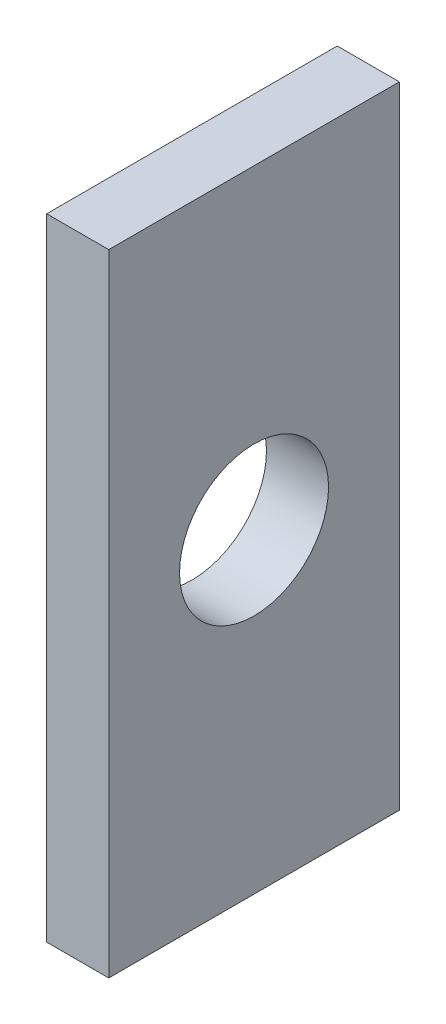
ISO-10303-21;
HEADER;
FILE_DESCRIPTION(('STEP AP214'),'2;1');
FILE_NAME('part.step','',(''),(''),'','','');
FILE_SCHEMA(('AUTOMOTIVE_DESIGN { 1 0 10303 214 1 1 1 1 }'));
ENDSEC;
DATA;
#1=APPLICATION_CONTEXT('core data for automotive mechanical design processes');
#2=APPLICATION_PROTOCOL_DEFINITION('international standard','automotive_design',2000,#1);
#3=PRODUCT_CONTEXT('',#1,'mechanical');
#4=PRODUCT('Part','Part','',(#3));
#5=PRODUCT_RELATED_PRODUCT_CATEGORY('part','',(#4));
#6=PRODUCT_DEFINITION_FORMATION('','',#4);
#7=PRODUCT_DEFINITION_CONTEXT('part definition',#1,'design');
#8=PRODUCT_DEFINITION('design','',#6,#7);
#9=PRODUCT_DEFINITION_SHAPE('','',#8);
#10=(LENGTH_UNIT() NAMED_UNIT(*) SI_UNIT(.MILLI.,.METRE.));
#11=(NAMED_UNIT(*) PLANE_ANGLE_UNIT() SI_UNIT($,.RADIAN.));
#12=(NAMED_UNIT(*) SI_UNIT($,.STERADIAN.) SOLID_ANGLE_UNIT());
#13=UNCERTAINTY_MEASURE_WITH_UNIT(LENGTH_MEASURE(1.E-05),#10,'distance_accuracy_value','');
#14=(GEOMETRIC_REPRESENTATION_CONTEXT(3) GLOBAL_UNCERTAINTY_ASSIGNED_CONTEXT((#13)) GLOBAL_UNIT_ASSIGNED_CONTEXT((#10,
#11,#12)) REPRESENTATION_CONTEXT('',''));
#15=CARTESIAN_POINT('',(0.,0.,0.));
#16=DIRECTION('',(0.,0.,1.));
#17=DIRECTION('',(1.,0.,0.));
#18=AXIS2_PLACEMENT_3D('',#15,#16,#17);
#19=CARTESIAN_POINT('',(2.5,0.,0.));
#20=DIRECTION('',(1.,0.,0.));
#21=DIRECTION('',(0.,0.,-1.));
#22=AXIS2_PLACEMENT_3D('',#19,#20,#21);
#23=PLANE('',#22);
#24=DIRECTION('',(0.,0.,1.));
#25=VECTOR('',#24,1.);
#26=CARTESIAN_POINT('',(2.5,-12.5960851198387,261.082453234326));
#27=LINE('',#26,#25);
#28=CARTESIAN_POINT('',(2.5,-12.5960851198387,261.082453234326));
#29=VERTEX_POINT('',#28);
#30=CARTESIAN_POINT('',(2.5,-12.5960851198387,272.782453234326));
#31=VERTEX_POINT('',#30);
#32=EDGE_CURVE('E95',#29,#31,#27,.T.);
#33=ORIENTED_EDGE('',*,*,#32,.T.);
#34=DIRECTION('',(0.,-1.,0.));
#35=VECTOR('',#34,1.);
#36=CARTESIAN_POINT('',(2.5,-12.5960851198387,272.782453234326));
#37=LINE('',#36,#35);
#38=CARTESIAN_POINT('',(2.5,-37.9960851198387,272.782453234326));
#39=VERTEX_POINT('',#38);
#40=EDGE_CURVE('E90',#31,#39,#37,.T.);
#41=ORIENTED_EDGE('',*,*,#40,.T.);
#42=DIRECTION('',(0.,0.,-1.));
#43=VECTOR('',#42,1.);
#44=CARTESIAN_POINT('',(2.5,-37.9960851198387,272.782453234326));
#45=LINE('',#44,#43);
#46=CARTESIAN_POINT('',(2.5,-37.9960851198387,261.082453234326));
#47=VERTEX_POINT('',#46);
#48=EDGE_CURVE('E93',#39,#47,#45,.T.);
#49=ORIENTED_EDGE('',*,*,#48,.T.);
#50=DIRECTION('',(0.,1.,0.));
#51=VECTOR('',#50,1.);
#52=CARTESIAN_POINT('',(2.5,-37.9960851198387,261.082453234326));
#53=LINE('',#52,#51);
#54=EDGE_CURVE('E60',#47,#29,#53,.T.);
#55=ORIENTED_EDGE('',*,*,#54,.T.);
#56=EDGE_LOOP('',(#33,#41,#49,#55));
#57=FACE_BOUND('',#56,.T.);
#58=CARTESIAN_POINT('',(2.5,-25.2960851198387,266.932453234328));
#59=DIRECTION('',(1.,0.,0.));
#60=DIRECTION('',(0.,0.,-1.));
#61=AXIS2_PLACEMENT_3D('',#58,#59,#60);
#62=CIRCLE('',#61,2.99999999999999);
#63=CARTESIAN_POINT('',(2.5,-25.2960851198387,263.932453234328));
#64=VERTEX_POINT('',#63);
#65=EDGE_CURVE('E110',#64,#64,#62,.T.);
#66=ORIENTED_EDGE('',*,*,#65,.F.);
#67=EDGE_LOOP('',(#66));
#68=FACE_BOUND('',#67,.T.);
#69=ADVANCED_FACE('F43',(#57,#68),#23,.T.);
#70=CARTESIAN_POINT('',(0.,0.,0.));
#71=DIRECTION('',(1.,0.,0.));
#72=DIRECTION('',(0.,0.,-1.));
#73=AXIS2_PLACEMENT_3D('',#70,#71,#72);
#74=PLANE('',#73);
#75=DIRECTION('',(0.,0.,1.));
#76=VECTOR('',#75,1.);
#77=CARTESIAN_POINT('',(0.,-12.5960851198387,261.082453234326));
#78=LINE('',#77,#76);
#79=CARTESIAN_POINT('',(0.,-12.5960851198387,261.082453234326));
#80=VERTEX_POINT('',#79);
#81=CARTESIAN_POINT('',(0.,-12.5960851198387,272.782453234326));
#82=VERTEX_POINT('',#81);
#83=EDGE_CURVE('E107',#80,#82,#78,.T.);
#84=ORIENTED_EDGE('',*,*,#83,.F.);
#85=DIRECTION('',(0.,1.,0.));
#86=VECTOR('',#85,1.);
#87=CARTESIAN_POINT('',(0.,-37.9960851198387,261.082453234326));
#88=LINE('',#87,#86);
#89=CARTESIAN_POINT('',(0.,-37.9960851198387,261.082453234326));
#90=VERTEX_POINT('',#89);
#91=EDGE_CURVE('E83',#90,#80,#88,.T.);
#92=ORIENTED_EDGE('',*,*,#91,.F.);
#93=DIRECTION('',(0.,0.,-1.));
#94=VECTOR('',#93,1.);
#95=CARTESIAN_POINT('',(0.,-37.9960851198387,272.782453234326));
#96=LINE('',#95,#94);
#97=CARTESIAN_POINT('',(0.,-37.9960851198387,272.782453234326));
#98=VERTEX_POINT('',#97);
#99=EDGE_CURVE('E77',#98,#90,#96,.T.);
#100=ORIENTED_EDGE('',*,*,#99,.F.);
#101=DIRECTION('',(0.,-1.,0.));
#102=VECTOR('',#101,1.);
#103=CARTESIAN_POINT('',(0.,-12.5960851198387,272.782453234326));
#104=LINE('',#103,#102);
#105=EDGE_CURVE('E99',#82,#98,#104,.T.);
#106=ORIENTED_EDGE('',*,*,#105,.F.);
#107=EDGE_LOOP('',(#84,#92,#100,#106));
#108=FACE_BOUND('',#107,.T.);
#109=CARTESIAN_POINT('',(0.,-25.2960851198387,266.932453234328));
#110=DIRECTION('',(1.,0.,0.));
#111=DIRECTION('',(0.,0.,-1.));
#112=AXIS2_PLACEMENT_3D('',#109,#110,#111);
#113=CIRCLE('',#112,2.99999999999999);
#114=CARTESIAN_POINT('',(0.,-25.2960851198387,263.932453234328));
#115=VERTEX_POINT('',#114);
#116=EDGE_CURVE('E122',#115,#115,#113,.T.);
#117=ORIENTED_EDGE('',*,*,#116,.T.);
#118=EDGE_LOOP('',(#117));
#119=FACE_BOUND('',#118,.T.);
#120=ADVANCED_FACE('F118',(#108,#119),#74,.F.);
#121=CARTESIAN_POINT('',(2.5,-12.5960851198387,261.082453234326));
#122=DIRECTION('',(0.,-1.,0.));
#123=DIRECTION('',(0.,0.,-1.));
#124=AXIS2_PLACEMENT_3D('',#121,#122,#123);
#125=PLANE('',#124);
#126=ORIENTED_EDGE('',*,*,#83,.T.);
#127=DIRECTION('',(-1.,0.,0.));
#128=VECTOR('',#127,1.);
#129=CARTESIAN_POINT('',(2.5,-12.5960851198387,272.782453234326));
#130=LINE('',#129,#128);
#131=EDGE_CURVE('E11',#31,#82,#130,.T.);
#132=ORIENTED_EDGE('',*,*,#131,.F.);
#133=ORIENTED_EDGE('',*,*,#32,.F.);
#134=DIRECTION('',(-1.,0.,0.));
#135=VECTOR('',#134,1.);
#136=CARTESIAN_POINT('',(2.5,-12.5960851198387,261.082453234326));
#137=LINE('',#136,#135);
#138=EDGE_CURVE('E103',#29,#80,#137,.T.);
#139=ORIENTED_EDGE('',*,*,#138,.T.);
#140=EDGE_LOOP('',(#126,#132,#133,#139));
#141=FACE_BOUND('',#140,.T.);
#142=ADVANCED_FACE('F45',(#141),#125,.F.);
#143=CARTESIAN_POINT('',(2.5,-12.5960851198387,272.782453234326));
#144=DIRECTION('',(0.,0.,-1.));
#145=DIRECTION('',(-1.,0.,0.));
#146=AXIS2_PLACEMENT_3D('',#143,#144,#145);
#147=PLANE('',#146);
#148=ORIENTED_EDGE('',*,*,#105,.T.);
#149=DIRECTION('',(-1.,0.,0.));
#150=VECTOR('',#149,1.);
#151=CARTESIAN_POINT('',(2.5,-37.9960851198387,272.782453234326));
#152=LINE('',#151,#150);
#153=EDGE_CURVE('E52',#39,#98,#152,.T.);
#154=ORIENTED_EDGE('',*,*,#153,.F.);
#155=ORIENTED_EDGE('',*,*,#40,.F.);
#156=ORIENTED_EDGE('',*,*,#131,.T.);
#157=EDGE_LOOP('',(#148,#154,#155,#156));
#158=FACE_BOUND('',#157,.T.);
#159=ADVANCED_FACE('F98',(#158),#147,.F.);
#160=CARTESIAN_POINT('',(2.5,-37.9960851198387,272.782453234326));
#161=DIRECTION('',(0.,1.,0.));
#162=DIRECTION('',(0.,0.,1.));
#163=AXIS2_PLACEMENT_3D('',#160,#161,#162);
#164=PLANE('',#163);
#165=ORIENTED_EDGE('',*,*,#99,.T.);
#166=DIRECTION('',(-1.,0.,0.));
#167=VECTOR('',#166,1.);
#168=CARTESIAN_POINT('',(2.5,-37.9960851198387,261.082453234326));
#169=LINE('',#168,#167);
#170=EDGE_CURVE('E100',#47,#90,#169,.T.);
#171=ORIENTED_EDGE('',*,*,#170,.F.);
#172=ORIENTED_EDGE('',*,*,#48,.F.);
#173=ORIENTED_EDGE('',*,*,#153,.T.);
#174=EDGE_LOOP('',(#165,#171,#172,#173));
#175=FACE_BOUND('',#174,.T.);
#176=ADVANCED_FACE('F101',(#175),#164,.F.);
#177=CARTESIAN_POINT('',(2.5,-37.9960851198387,261.082453234326));
#178=DIRECTION('',(0.,0.,1.));
#179=DIRECTION('',(1.,0.,0.));
#180=AXIS2_PLACEMENT_3D('',#177,#178,#179);
#181=PLANE('',#180);
#182=ORIENTED_EDGE('',*,*,#91,.T.);
#183=ORIENTED_EDGE('',*,*,#138,.F.);
#184=ORIENTED_EDGE('',*,*,#54,.F.);
#185=ORIENTED_EDGE('',*,*,#170,.T.);
#186=EDGE_LOOP('',(#182,#183,#184,#185));
#187=FACE_BOUND('',#186,.T.);
#188=ADVANCED_FACE('F115',(#187),#181,.F.);
#189=CARTESIAN_POINT('',(2.5,-25.2960851198387,266.932453234328));
#190=DIRECTION('',(-1.,0.,0.));
#191=DIRECTION('',(0.,0.,1.));
#192=AXIS2_PLACEMENT_3D('',#189,#190,#191);
#193=CYLINDRICAL_SURFACE('',#192,2.99999999999999);
#194=ORIENTED_EDGE('',*,*,#65,.T.);
#195=EDGE_LOOP('',(#194));
#196=FACE_BOUND('',#195,.T.);
#197=ORIENTED_EDGE('',*,*,#116,.F.);
#198=EDGE_LOOP('',(#197));
#199=FACE_BOUND('',#198,.T.);
#200=ADVANCED_FACE('F128',(#196,#199),#193,.F.);
#201=CLOSED_SHELL('',(#69,#120,#142,#159,#176,#188,#200));
#202=MANIFOLD_SOLID_BREP('B2',#201);
#203=ADVANCED_BREP_SHAPE_REPRESENTATION('',(#18,#202),#14);
#204=SHAPE_DEFINITION_REPRESENTATION(#9,#203);
ENDSEC;
END-ISO-10303-21;
